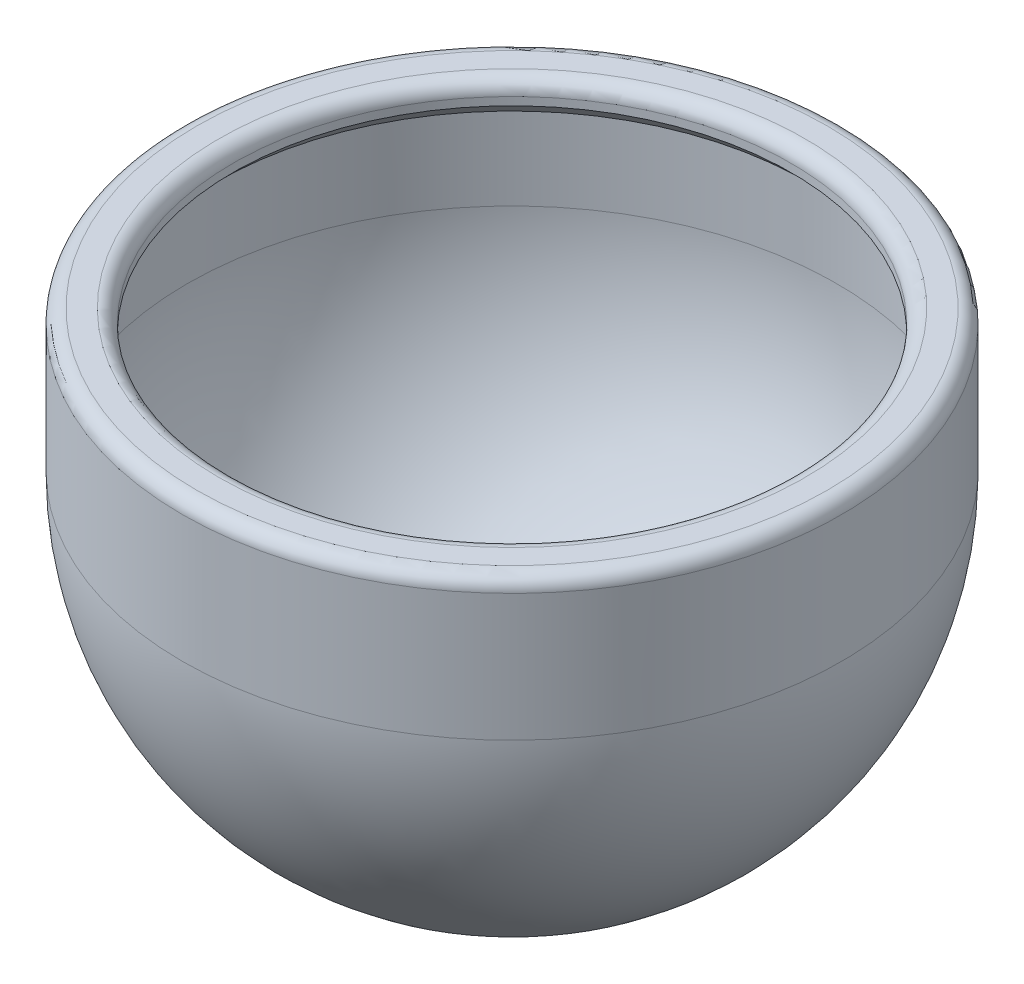
ISO-10303-21;
HEADER;
FILE_DESCRIPTION(('STEP AP214'),'2;1');
FILE_NAME('part.step','',(''),(''),'','','');
FILE_SCHEMA(('AUTOMOTIVE_DESIGN { 1 0 10303 214 1 1 1 1 }'));
ENDSEC;
DATA;
#1=APPLICATION_CONTEXT('core data for automotive mechanical design processes');
#2=APPLICATION_PROTOCOL_DEFINITION('international standard','automotive_design',2000,#1);
#3=PRODUCT_CONTEXT('',#1,'mechanical');
#4=PRODUCT('Part','Part','',(#3));
#5=PRODUCT_RELATED_PRODUCT_CATEGORY('part','',(#4));
#6=PRODUCT_DEFINITION_FORMATION('','',#4);
#7=PRODUCT_DEFINITION_CONTEXT('part definition',#1,'design');
#8=PRODUCT_DEFINITION('design','',#6,#7);
#9=PRODUCT_DEFINITION_SHAPE('','',#8);
#10=(LENGTH_UNIT() NAMED_UNIT(*) SI_UNIT(.MILLI.,.METRE.));
#11=(NAMED_UNIT(*) PLANE_ANGLE_UNIT() SI_UNIT($,.RADIAN.));
#12=(NAMED_UNIT(*) SI_UNIT($,.STERADIAN.) SOLID_ANGLE_UNIT());
#13=UNCERTAINTY_MEASURE_WITH_UNIT(LENGTH_MEASURE(1.E-05),#10,'distance_accuracy_value','');
#14=(GEOMETRIC_REPRESENTATION_CONTEXT(3) GLOBAL_UNCERTAINTY_ASSIGNED_CONTEXT((#13)) GLOBAL_UNIT_ASSIGNED_CONTEXT((#10,
#11,#12)) REPRESENTATION_CONTEXT('',''));
#15=CARTESIAN_POINT('',(0.,0.,0.));
#16=DIRECTION('',(0.,0.,1.));
#17=DIRECTION('',(1.,0.,0.));
#18=AXIS2_PLACEMENT_3D('',#15,#16,#17);
#19=CARTESIAN_POINT('',(0.,27.,0.));
#20=DIRECTION('',(0.,1.,0.));
#21=DIRECTION('',(0.,0.,1.));
#22=AXIS2_PLACEMENT_3D('',#19,#20,#21);
#23=TOROIDAL_SURFACE('',#22,67.,3.);
#24=CARTESIAN_POINT('',(0.,30.,0.));
#25=DIRECTION('',(0.,1.,0.));
#26=DIRECTION('',(0.,0.,1.));
#27=AXIS2_PLACEMENT_3D('',#24,#25,#26);
#28=CIRCLE('',#27,67.);
#29=CARTESIAN_POINT('',(0.,30.,67.));
#30=VERTEX_POINT('',#29);
#31=EDGE_CURVE('E87',#30,#30,#28,.T.);
#32=ORIENTED_EDGE('',*,*,#31,.F.);
#33=EDGE_LOOP('',(#32));
#34=FACE_BOUND('',#33,.T.);
#35=CARTESIAN_POINT('',(0.,27.,0.));
#36=DIRECTION('',(0.,1.,0.));
#37=DIRECTION('',(0.,0.,1.));
#38=AXIS2_PLACEMENT_3D('',#35,#36,#37);
#39=CIRCLE('',#38,70.);
#40=CARTESIAN_POINT('',(0.,27.,70.));
#41=VERTEX_POINT('',#40);
#42=EDGE_CURVE('E63',#41,#41,#39,.T.);
#43=ORIENTED_EDGE('',*,*,#42,.T.);
#44=EDGE_LOOP('',(#43));
#45=FACE_BOUND('',#44,.T.);
#46=ADVANCED_FACE('F36',(#34,#45),#23,.T.);
#47=CARTESIAN_POINT('',(0.,64.2312837108954,0.));
#48=DIRECTION('',(0.,1.,0.));
#49=DIRECTION('',(0.,0.,1.));
#50=AXIS2_PLACEMENT_3D('',#47,#48,#49);
#51=CYLINDRICAL_SURFACE('',#50,70.);
#52=ORIENTED_EDGE('',*,*,#42,.F.);
#53=EDGE_LOOP('',(#52));
#54=FACE_BOUND('',#53,.T.);
#55=CARTESIAN_POINT('',(0.,0.,0.));
#56=DIRECTION('',(0.,1.,0.));
#57=DIRECTION('',(0.,0.,1.));
#58=AXIS2_PLACEMENT_3D('',#55,#56,#57);
#59=CIRCLE('',#58,70.);
#60=CARTESIAN_POINT('',(0.,0.,70.));
#61=VERTEX_POINT('',#60);
#62=EDGE_CURVE('E66',#61,#61,#59,.T.);
#63=ORIENTED_EDGE('',*,*,#62,.T.);
#64=EDGE_LOOP('',(#63));
#65=FACE_BOUND('',#64,.T.);
#66=ADVANCED_FACE('F95',(#54,#65),#51,.T.);
#67=CARTESIAN_POINT('',(0.,0.,0.));
#68=DIRECTION('',(0.,1.,0.));
#69=DIRECTION('',(-1.,0.,0.));
#70=AXIS2_PLACEMENT_3D('',#67,#68,#69);
#71=SPHERICAL_SURFACE('',#70,70.);
#72=ORIENTED_EDGE('',*,*,#62,.F.);
#73=EDGE_LOOP('',(#72));
#74=FACE_BOUND('',#73,.T.);
#75=ADVANCED_FACE('F101',(#74),#71,.T.);
#76=CARTESIAN_POINT('',(0.,0.,0.));
#77=DIRECTION('',(0.,1.,0.));
#78=DIRECTION('',(-1.,0.,0.));
#79=AXIS2_PLACEMENT_3D('',#76,#77,#78);
#80=SPHERICAL_SURFACE('',#79,69.);
#81=CARTESIAN_POINT('',(0.,0.,0.));
#82=DIRECTION('',(0.,1.,0.));
#83=DIRECTION('',(0.,0.,1.));
#84=AXIS2_PLACEMENT_3D('',#81,#82,#83);
#85=CIRCLE('',#84,69.);
#86=CARTESIAN_POINT('',(0.,0.,69.));
#87=VERTEX_POINT('',#86);
#88=EDGE_CURVE('E69',#87,#87,#85,.T.);
#89=ORIENTED_EDGE('',*,*,#88,.T.);
#90=EDGE_LOOP('',(#89));
#91=FACE_BOUND('',#90,.T.);
#92=ADVANCED_FACE('F106',(#91),#80,.F.);
#93=CARTESIAN_POINT('',(0.,64.2312837108954,0.));
#94=DIRECTION('',(0.,1.,0.));
#95=DIRECTION('',(0.,0.,1.));
#96=AXIS2_PLACEMENT_3D('',#93,#94,#95);
#97=CYLINDRICAL_SURFACE('',#96,69.);
#98=CARTESIAN_POINT('',(0.,22.,0.));
#99=DIRECTION('',(0.,1.,0.));
#100=DIRECTION('',(0.,0.,1.));
#101=AXIS2_PLACEMENT_3D('',#98,#99,#100);
#102=CIRCLE('',#101,69.);
#103=CARTESIAN_POINT('',(0.,22.,69.));
#104=VERTEX_POINT('',#103);
#105=EDGE_CURVE('E72',#104,#104,#102,.T.);
#106=ORIENTED_EDGE('',*,*,#105,.T.);
#107=EDGE_LOOP('',(#106));
#108=FACE_BOUND('',#107,.T.);
#109=ORIENTED_EDGE('',*,*,#88,.F.);
#110=EDGE_LOOP('',(#109));
#111=FACE_BOUND('',#110,.T.);
#112=ADVANCED_FACE('F111',(#108,#111),#97,.F.);
#113=CARTESIAN_POINT('',(0.,22.,0.));
#114=DIRECTION('',(0.,-1.,0.));
#115=DIRECTION('',(0.,0.,-1.));
#116=AXIS2_PLACEMENT_3D('',#113,#114,#115);
#117=PLANE('',#116);
#118=CARTESIAN_POINT('',(0.,22.,0.));
#119=DIRECTION('',(0.,1.,0.));
#120=DIRECTION('',(0.,0.,1.));
#121=AXIS2_PLACEMENT_3D('',#118,#119,#120);
#122=CIRCLE('',#121,62.5857864376269);
#123=CARTESIAN_POINT('',(0.,22.,62.5857864376269));
#124=VERTEX_POINT('',#123);
#125=EDGE_CURVE('E75',#124,#124,#122,.T.);
#126=ORIENTED_EDGE('',*,*,#125,.T.);
#127=EDGE_LOOP('',(#126));
#128=FACE_BOUND('',#127,.T.);
#129=ORIENTED_EDGE('',*,*,#105,.F.);
#130=EDGE_LOOP('',(#129));
#131=FACE_BOUND('',#130,.T.);
#132=ADVANCED_FACE('F175',(#128,#131),#117,.T.);
#133=CARTESIAN_POINT('',(0.,25.2928932188135,0.));
#134=DIRECTION('',(0.,-1.,0.));
#135=DIRECTION('',(0.,0.,-1.));
#136=AXIS2_PLACEMENT_3D('',#133,#134,#135);
#137=CONICAL_SURFACE('',#136,59.2928932188135,0.785398163397448);
#138=ORIENTED_EDGE('',*,*,#125,.F.);
#139=EDGE_LOOP('',(#138));
#140=FACE_BOUND('',#139,.T.);
#141=CARTESIAN_POINT('',(0.,25.2928932188135,0.));
#142=DIRECTION('',(0.,1.,0.));
#143=DIRECTION('',(0.,0.,1.));
#144=AXIS2_PLACEMENT_3D('',#141,#142,#143);
#145=CIRCLE('',#144,59.2928932188135);
#146=CARTESIAN_POINT('',(0.,25.2928932188135,59.2928932188135));
#147=VERTEX_POINT('',#146);
#148=EDGE_CURVE('E78',#147,#147,#145,.T.);
#149=ORIENTED_EDGE('',*,*,#148,.T.);
#150=EDGE_LOOP('',(#149));
#151=FACE_BOUND('',#150,.T.);
#152=ADVANCED_FACE('F167',(#140,#151),#137,.F.);
#153=CARTESIAN_POINT('',(0.,64.2312837108954,0.));
#154=DIRECTION('',(0.,1.,0.));
#155=DIRECTION('',(0.,0.,1.));
#156=AXIS2_PLACEMENT_3D('',#153,#154,#155);
#157=CYLINDRICAL_SURFACE('',#156,59.2928932188135);
#158=ORIENTED_EDGE('',*,*,#148,.F.);
#159=EDGE_LOOP('',(#158));
#160=FACE_BOUND('',#159,.T.);
#161=CARTESIAN_POINT('',(0.,27.,0.));
#162=DIRECTION('',(0.,1.,0.));
#163=DIRECTION('',(0.,0.,1.));
#164=AXIS2_PLACEMENT_3D('',#161,#162,#163);
#165=CIRCLE('',#164,59.2928932188135);
#166=CARTESIAN_POINT('',(0.,27.,59.2928932188135));
#167=VERTEX_POINT('',#166);
#168=EDGE_CURVE('E81',#167,#167,#165,.T.);
#169=ORIENTED_EDGE('',*,*,#168,.T.);
#170=EDGE_LOOP('',(#169));
#171=FACE_BOUND('',#170,.T.);
#172=ADVANCED_FACE('F159',(#160,#171),#157,.F.);
#173=CARTESIAN_POINT('',(0.,27.,0.));
#174=DIRECTION('',(0.,1.,0.));
#175=DIRECTION('',(0.,0.,1.));
#176=AXIS2_PLACEMENT_3D('',#173,#174,#175);
#177=TOROIDAL_SURFACE('',#176,62.2928932188135,3.);
#178=CARTESIAN_POINT('',(0.,30.,0.));
#179=DIRECTION('',(0.,1.,0.));
#180=DIRECTION('',(0.,0.,1.));
#181=AXIS2_PLACEMENT_3D('',#178,#179,#180);
#182=CIRCLE('',#181,62.2928932188135);
#183=CARTESIAN_POINT('',(0.,30.,62.2928932188135));
#184=VERTEX_POINT('',#183);
#185=EDGE_CURVE('E84',#184,#184,#182,.T.);
#186=ORIENTED_EDGE('',*,*,#185,.T.);
#187=EDGE_LOOP('',(#186));
#188=FACE_BOUND('',#187,.T.);
#189=ORIENTED_EDGE('',*,*,#168,.F.);
#190=EDGE_LOOP('',(#189));
#191=FACE_BOUND('',#190,.T.);
#192=ADVANCED_FACE('F151',(#188,#191),#177,.T.);
#193=CARTESIAN_POINT('',(0.,30.,0.));
#194=DIRECTION('',(0.,-1.,0.));
#195=DIRECTION('',(0.,0.,-1.));
#196=AXIS2_PLACEMENT_3D('',#193,#194,#195);
#197=PLANE('',#196);
#198=ORIENTED_EDGE('',*,*,#185,.F.);
#199=EDGE_LOOP('',(#198));
#200=FACE_BOUND('',#199,.T.);
#201=ORIENTED_EDGE('',*,*,#31,.T.);
#202=EDGE_LOOP('',(#201));
#203=FACE_BOUND('',#202,.T.);
#204=ADVANCED_FACE('F91',(#200,#203),#197,.F.);
#205=CLOSED_SHELL('',(#46,#66,#75,#92,#112,#132,#152,#172,#192,#204));
#206=CARTESIAN_POINT('',(0.,26.,0.));
#207=DIRECTION('',(0.,1.,0.));
#208=DIRECTION('',(0.,0.,1.));
#209=AXIS2_PLACEMENT_3D('',#206,#207,#208);
#210=TOROIDAL_SURFACE('',#209,63.,3.);
#211=CARTESIAN_POINT('',(0.,29.,0.));
#212=DIRECTION('',(0.,1.,0.));
#213=DIRECTION('',(0.,0.,1.));
#214=AXIS2_PLACEMENT_3D('',#211,#212,#213);
#215=CIRCLE('',#214,63.);
#216=CARTESIAN_POINT('',(0.,29.,63.));
#217=VERTEX_POINT('',#216);
#218=EDGE_CURVE('E60',#217,#217,#215,.T.);
#219=ORIENTED_EDGE('',*,*,#218,.F.);
#220=EDGE_LOOP('',(#219));
#221=FACE_BOUND('',#220,.T.);
#222=CARTESIAN_POINT('',(0.,26.,0.));
#223=DIRECTION('',(0.,1.,0.));
#224=DIRECTION('',(0.,0.,1.));
#225=AXIS2_PLACEMENT_3D('',#222,#223,#224);
#226=CIRCLE('',#225,60.);
#227=CARTESIAN_POINT('',(0.,26.,60.));
#228=VERTEX_POINT('',#227);
#229=EDGE_CURVE('E10',#228,#228,#226,.T.);
#230=ORIENTED_EDGE('',*,*,#229,.T.);
#231=EDGE_LOOP('',(#230));
#232=FACE_BOUND('',#231,.T.);
#233=ADVANCED_FACE('F38',(#221,#232),#210,.F.);
#234=CARTESIAN_POINT('',(0.,26.,0.));
#235=DIRECTION('',(0.,-1.,0.));
#236=DIRECTION('',(0.,0.,-1.));
#237=AXIS2_PLACEMENT_3D('',#234,#235,#236);
#238=CONICAL_SURFACE('',#237,60.,0.785398163397436);
#239=CARTESIAN_POINT('',(0.,23.,0.));
#240=DIRECTION('',(0.,1.,0.));
#241=DIRECTION('',(0.,0.,1.));
#242=AXIS2_PLACEMENT_3D('',#239,#240,#241);
#243=CIRCLE('',#242,62.9999999999999);
#244=CARTESIAN_POINT('',(0.,23.,62.9999999999999));
#245=VERTEX_POINT('',#244);
#246=EDGE_CURVE('E44',#245,#245,#243,.T.);
#247=ORIENTED_EDGE('',*,*,#246,.T.);
#248=EDGE_LOOP('',(#247));
#249=FACE_BOUND('',#248,.T.);
#250=ORIENTED_EDGE('',*,*,#229,.F.);
#251=EDGE_LOOP('',(#250));
#252=FACE_BOUND('',#251,.T.);
#253=ADVANCED_FACE('F131',(#249,#252),#238,.T.);
#254=CARTESIAN_POINT('',(0.,23.,0.));
#255=DIRECTION('',(0.,-1.,0.));
#256=DIRECTION('',(0.,0.,-1.));
#257=AXIS2_PLACEMENT_3D('',#254,#255,#256);
#258=PLANE('',#257);
#259=ORIENTED_EDGE('',*,*,#246,.F.);
#260=EDGE_LOOP('',(#259));
#261=FACE_BOUND('',#260,.T.);
#262=CARTESIAN_POINT('',(0.,23.,0.));
#263=DIRECTION('',(0.,1.,0.));
#264=DIRECTION('',(0.,0.,1.));
#265=AXIS2_PLACEMENT_3D('',#262,#263,#264);
#266=CIRCLE('',#265,69.);
#267=CARTESIAN_POINT('',(0.,23.,69.));
#268=VERTEX_POINT('',#267);
#269=EDGE_CURVE('E48',#268,#268,#266,.T.);
#270=ORIENTED_EDGE('',*,*,#269,.T.);
#271=EDGE_LOOP('',(#270));
#272=FACE_BOUND('',#271,.T.);
#273=ADVANCED_FACE('F128',(#261,#272),#258,.F.);
#274=CARTESIAN_POINT('',(0.,64.2312837108954,0.));
#275=DIRECTION('',(0.,1.,0.));
#276=DIRECTION('',(0.,0.,1.));
#277=AXIS2_PLACEMENT_3D('',#274,#275,#276);
#278=CYLINDRICAL_SURFACE('',#277,69.);
#279=CARTESIAN_POINT('',(0.,27.,0.));
#280=DIRECTION('',(0.,1.,0.));
#281=DIRECTION('',(0.,0.,1.));
#282=AXIS2_PLACEMENT_3D('',#279,#280,#281);
#283=CIRCLE('',#282,69.);
#284=CARTESIAN_POINT('',(0.,27.,69.));
#285=VERTEX_POINT('',#284);
#286=EDGE_CURVE('E52',#285,#285,#283,.T.);
#287=ORIENTED_EDGE('',*,*,#286,.T.);
#288=EDGE_LOOP('',(#287));
#289=FACE_BOUND('',#288,.T.);
#290=ORIENTED_EDGE('',*,*,#269,.F.);
#291=EDGE_LOOP('',(#290));
#292=FACE_BOUND('',#291,.T.);
#293=ADVANCED_FACE('F124',(#289,#292),#278,.F.);
#294=CARTESIAN_POINT('',(0.,27.,0.));
#295=DIRECTION('',(0.,1.,0.));
#296=DIRECTION('',(0.,0.,1.));
#297=AXIS2_PLACEMENT_3D('',#294,#295,#296);
#298=TOROIDAL_SURFACE('',#297,67.,1.99999999999999);
#299=ORIENTED_EDGE('',*,*,#286,.F.);
#300=EDGE_LOOP('',(#299));
#301=FACE_BOUND('',#300,.T.);
#302=CARTESIAN_POINT('',(0.,29.,0.));
#303=DIRECTION('',(0.,1.,0.));
#304=DIRECTION('',(0.,0.,1.));
#305=AXIS2_PLACEMENT_3D('',#302,#303,#304);
#306=CIRCLE('',#305,67.);
#307=CARTESIAN_POINT('',(0.,29.,67.));
#308=VERTEX_POINT('',#307);
#309=EDGE_CURVE('E57',#308,#308,#306,.T.);
#310=ORIENTED_EDGE('',*,*,#309,.T.);
#311=EDGE_LOOP('',(#310));
#312=FACE_BOUND('',#311,.T.);
#313=ADVANCED_FACE('F119',(#301,#312),#298,.F.);
#314=CARTESIAN_POINT('',(0.,29.,0.));
#315=DIRECTION('',(0.,-1.,0.));
#316=DIRECTION('',(0.,0.,-1.));
#317=AXIS2_PLACEMENT_3D('',#314,#315,#316);
#318=PLANE('',#317);
#319=ORIENTED_EDGE('',*,*,#218,.T.);
#320=EDGE_LOOP('',(#319));
#321=FACE_BOUND('',#320,.T.);
#322=ORIENTED_EDGE('',*,*,#309,.F.);
#323=EDGE_LOOP('',(#322));
#324=FACE_BOUND('',#323,.T.);
#325=ADVANCED_FACE('F116',(#321,#324),#318,.T.);
#326=CLOSED_SHELL('',(#233,#253,#273,#293,#313,#325));
#327=ORIENTED_CLOSED_SHELL('',*,#326,.T.);
#328=BREP_WITH_VOIDS('B2',#205,(#327));
#329=ADVANCED_BREP_SHAPE_REPRESENTATION('',(#18,#328),#14);
#330=SHAPE_DEFINITION_REPRESENTATION(#9,#329);
ENDSEC;
END-ISO-10303-21;
